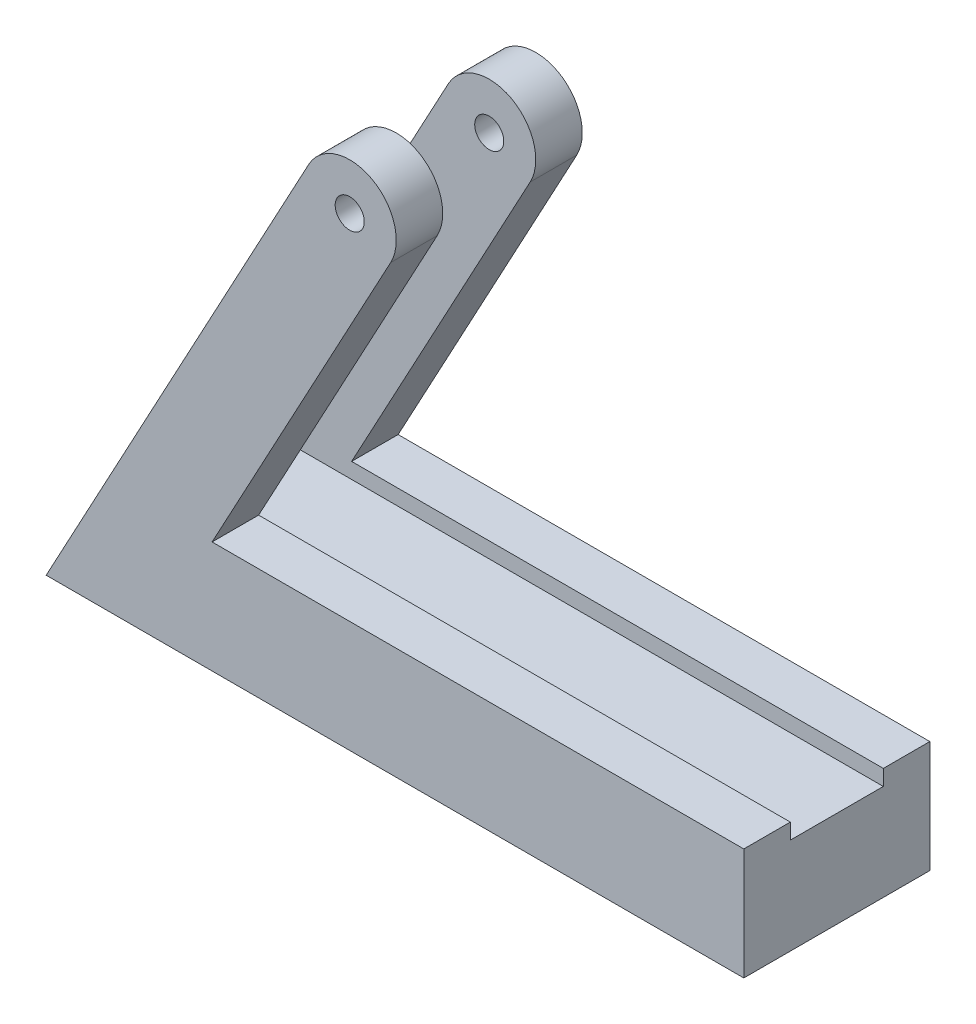
ISO-10303-21;
HEADER;
FILE_DESCRIPTION(('STEP AP214'),'2;1');
FILE_NAME('part.step','',(''),(''),'','','');
FILE_SCHEMA(('AUTOMOTIVE_DESIGN { 1 0 10303 214 1 1 1 1 }'));
ENDSEC;
DATA;
#1=APPLICATION_CONTEXT('core data for automotive mechanical design processes');
#2=APPLICATION_PROTOCOL_DEFINITION('international standard','automotive_design',2000,#1);
#3=PRODUCT_CONTEXT('',#1,'mechanical');
#4=PRODUCT('Part','Part','',(#3));
#5=PRODUCT_RELATED_PRODUCT_CATEGORY('part','',(#4));
#6=PRODUCT_DEFINITION_FORMATION('','',#4);
#7=PRODUCT_DEFINITION_CONTEXT('part definition',#1,'design');
#8=PRODUCT_DEFINITION('design','',#6,#7);
#9=PRODUCT_DEFINITION_SHAPE('','',#8);
#10=(LENGTH_UNIT() NAMED_UNIT(*) SI_UNIT(.MILLI.,.METRE.));
#11=(NAMED_UNIT(*) PLANE_ANGLE_UNIT() SI_UNIT($,.RADIAN.));
#12=(NAMED_UNIT(*) SI_UNIT($,.STERADIAN.) SOLID_ANGLE_UNIT());
#13=UNCERTAINTY_MEASURE_WITH_UNIT(LENGTH_MEASURE(1.E-05),#10,'distance_accuracy_value','');
#14=(GEOMETRIC_REPRESENTATION_CONTEXT(3) GLOBAL_UNCERTAINTY_ASSIGNED_CONTEXT((#13)) GLOBAL_UNIT_ASSIGNED_CONTEXT((#10,
#11,#12)) REPRESENTATION_CONTEXT('',''));
#15=CARTESIAN_POINT('',(0.,0.,0.));
#16=DIRECTION('',(0.,0.,1.));
#17=DIRECTION('',(1.,0.,0.));
#18=AXIS2_PLACEMENT_3D('',#15,#16,#17);
#19=CARTESIAN_POINT('',(13.0532365621115,20.,-7.99999999999997));
#20=DIRECTION('',(0.,0.,1.));
#21=DIRECTION('',(1.,0.,0.));
#22=AXIS2_PLACEMENT_3D('',#19,#20,#21);
#23=CYLINDRICAL_SURFACE('',#22,2.);
#24=CARTESIAN_POINT('',(13.0532365621115,20.,-2.));
#25=DIRECTION('',(0.,0.,1.));
#26=DIRECTION('',(1.,0.,0.));
#27=AXIS2_PLACEMENT_3D('',#24,#25,#26);
#28=CIRCLE('',#27,2.);
#29=CARTESIAN_POINT('',(11.2927328665036,20.949013560362,-2.));
#30=VERTEX_POINT('',#29);
#31=CARTESIAN_POINT('',(14.8137402577193,19.0509864396379,-2.));
#32=VERTEX_POINT('',#31);
#33=EDGE_CURVE('E280',#30,#32,#28,.F.);
#34=ORIENTED_EDGE('',*,*,#33,.F.);
#35=DIRECTION('',(0.,0.,1.));
#36=VECTOR('',#35,1.);
#37=CARTESIAN_POINT('',(11.2927328665036,20.949013560362,-7.99999999999997));
#38=LINE('',#37,#36);
#39=CARTESIAN_POINT('',(11.2927328665036,20.949013560362,0.));
#40=VERTEX_POINT('',#39);
#41=EDGE_CURVE('E117',#30,#40,#38,.T.);
#42=ORIENTED_EDGE('',*,*,#41,.T.);
#43=CARTESIAN_POINT('',(13.0532365621115,20.,0.));
#44=DIRECTION('',(0.,0.,1.));
#45=DIRECTION('',(-1.,0.,0.));
#46=AXIS2_PLACEMENT_3D('',#43,#44,#45);
#47=CIRCLE('',#46,2.);
#48=CARTESIAN_POINT('',(14.8137402577193,19.0509864396379,0.));
#49=VERTEX_POINT('',#48);
#50=EDGE_CURVE('E151',#49,#40,#47,.T.);
#51=ORIENTED_EDGE('',*,*,#50,.F.);
#52=DIRECTION('',(0.,0.,1.));
#53=VECTOR('',#52,1.);
#54=CARTESIAN_POINT('',(14.8137402577193,19.0509864396379,-7.99999999999997));
#55=LINE('',#54,#53);
#56=EDGE_CURVE('E118',#32,#49,#55,.T.);
#57=ORIENTED_EDGE('',*,*,#56,.F.);
#58=EDGE_LOOP('',(#34,#42,#51,#57));
#59=FACE_BOUND('',#58,.T.);
#60=ADVANCED_FACE('F35',(#59),#23,.T.);
#61=CARTESIAN_POINT('',(14.8137402577193,19.0509864396379,-7.99999999999997));
#62=DIRECTION('',(0.880251847803933,-0.474506780181023,0.));
#63=DIRECTION('',(0.474506780181023,0.880251847803933,0.));
#64=AXIS2_PLACEMENT_3D('',#61,#62,#63);
#65=PLANE('',#64);
#66=DIRECTION('',(-0.474506780181023,-0.880251847803933,0.));
#67=VECTOR('',#66,1.);
#68=CARTESIAN_POINT('',(14.8137402577193,19.0509864396379,-2.));
#69=LINE('',#68,#67);
#70=CARTESIAN_POINT('',(7.1350697497973,4.80637669834547,-2.));
#71=VERTEX_POINT('',#70);
#72=EDGE_CURVE('E277',#32,#71,#69,.T.);
#73=ORIENTED_EDGE('',*,*,#72,.F.);
#74=ORIENTED_EDGE('',*,*,#56,.T.);
#75=DIRECTION('',(0.474506780181023,0.880251847803933,0.));
#76=VECTOR('',#75,1.);
#77=CARTESIAN_POINT('',(14.8137402577193,19.0509864396379,0.));
#78=LINE('',#77,#76);
#79=CARTESIAN_POINT('',(7.1350697497973,4.80637669834547,0.));
#80=VERTEX_POINT('',#79);
#81=EDGE_CURVE('E148',#80,#49,#78,.T.);
#82=ORIENTED_EDGE('',*,*,#81,.F.);
#83=DIRECTION('',(0.,0.,1.));
#84=VECTOR('',#83,1.);
#85=CARTESIAN_POINT('',(7.1350697497973,4.80637669834547,-7.99999999999997));
#86=LINE('',#85,#84);
#87=EDGE_CURVE('E162',#71,#80,#86,.T.);
#88=ORIENTED_EDGE('',*,*,#87,.F.);
#89=EDGE_LOOP('',(#73,#74,#82,#88));
#90=FACE_BOUND('',#89,.T.);
#91=ADVANCED_FACE('F187',(#90),#65,.T.);
#92=CARTESIAN_POINT('',(7.1350697497973,4.80637669834547,-7.99999999999997));
#93=DIRECTION('',(0.,1.,0.));
#94=DIRECTION('',(-1.,0.,0.));
#95=AXIS2_PLACEMENT_3D('',#92,#93,#94);
#96=PLANE('',#95);
#97=DIRECTION('',(1.,0.,0.));
#98=VECTOR('',#97,1.);
#99=CARTESIAN_POINT('',(7.1350697497973,4.80637669834547,-2.));
#100=LINE('',#99,#98);
#101=CARTESIAN_POINT('',(30.,4.80637669834547,-2.));
#102=VERTEX_POINT('',#101);
#103=EDGE_CURVE('E274',#71,#102,#100,.T.);
#104=ORIENTED_EDGE('',*,*,#103,.F.);
#105=ORIENTED_EDGE('',*,*,#87,.T.);
#106=DIRECTION('',(-1.,0.,0.));
#107=VECTOR('',#106,1.);
#108=CARTESIAN_POINT('',(7.1350697497973,4.80637669834547,0.));
#109=LINE('',#108,#107);
#110=CARTESIAN_POINT('',(30.,4.80637669834547,0.));
#111=VERTEX_POINT('',#110);
#112=EDGE_CURVE('E145',#111,#80,#109,.T.);
#113=ORIENTED_EDGE('',*,*,#112,.F.);
#114=DIRECTION('',(0.,0.,1.));
#115=VECTOR('',#114,1.);
#116=CARTESIAN_POINT('',(30.,4.80637669834547,-7.99999999999997));
#117=LINE('',#116,#115);
#118=EDGE_CURVE('E166',#102,#111,#117,.T.);
#119=ORIENTED_EDGE('',*,*,#118,.F.);
#120=EDGE_LOOP('',(#104,#105,#113,#119));
#121=FACE_BOUND('',#120,.T.);
#122=ADVANCED_FACE('F175',(#121),#96,.T.);
#123=CARTESIAN_POINT('',(30.,0.,-7.99999999999997));
#124=DIRECTION('',(0.,-1.,0.));
#125=DIRECTION('',(1.,0.,0.));
#126=AXIS2_PLACEMENT_3D('',#123,#124,#125);
#127=PLANE('',#126);
#128=DIRECTION('',(1.,0.,0.));
#129=VECTOR('',#128,1.);
#130=CARTESIAN_POINT('',(30.,0.,0.));
#131=LINE('',#130,#129);
#132=CARTESIAN_POINT('',(0.,0.,0.));
#133=VERTEX_POINT('',#132);
#134=CARTESIAN_POINT('',(30.,0.,0.));
#135=VERTEX_POINT('',#134);
#136=EDGE_CURVE('E138',#133,#135,#131,.T.);
#137=ORIENTED_EDGE('',*,*,#136,.F.);
#138=DIRECTION('',(0.,0.,1.));
#139=VECTOR('',#138,1.);
#140=CARTESIAN_POINT('',(0.,0.,-7.99999999999997));
#141=LINE('',#140,#139);
#142=CARTESIAN_POINT('',(0.,0.,-7.99999999999997));
#143=VERTEX_POINT('',#142);
#144=EDGE_CURVE('E44',#143,#133,#141,.T.);
#145=ORIENTED_EDGE('',*,*,#144,.F.);
#146=DIRECTION('',(1.,0.,0.));
#147=VECTOR('',#146,1.);
#148=CARTESIAN_POINT('',(30.,0.,-7.99999999999997));
#149=LINE('',#148,#147);
#150=CARTESIAN_POINT('',(30.,0.,-7.99999999999997));
#151=VERTEX_POINT('',#150);
#152=EDGE_CURVE('E157',#143,#151,#149,.T.);
#153=ORIENTED_EDGE('',*,*,#152,.T.);
#154=DIRECTION('',(0.,0.,1.));
#155=VECTOR('',#154,1.);
#156=CARTESIAN_POINT('',(30.,0.,-7.99999999999997));
#157=LINE('',#156,#155);
#158=EDGE_CURVE('E91',#151,#135,#157,.T.);
#159=ORIENTED_EDGE('',*,*,#158,.T.);
#160=EDGE_LOOP('',(#137,#145,#153,#159));
#161=FACE_BOUND('',#160,.T.);
#162=ADVANCED_FACE('F37',(#161),#127,.T.);
#163=CARTESIAN_POINT('',(0.,0.,-7.99999999999997));
#164=DIRECTION('',(-0.880251847803933,0.474506780181023,0.));
#165=DIRECTION('',(-0.474506780181024,-0.880251847803933,0.));
#166=AXIS2_PLACEMENT_3D('',#163,#164,#165);
#167=PLANE('',#166);
#168=DIRECTION('',(0.474506780181024,0.880251847803933,0.));
#169=VECTOR('',#168,1.);
#170=CARTESIAN_POINT('',(0.,0.,-2.));
#171=LINE('',#170,#169);
#172=CARTESIAN_POINT('',(2.22830102184853,4.13369455162951,-2.));
#173=VERTEX_POINT('',#172);
#174=EDGE_CURVE('E142',#173,#30,#171,.T.);
#175=ORIENTED_EDGE('',*,*,#174,.F.);
#176=DIRECTION('',(0.,0.,1.));
#177=VECTOR('',#176,1.);
#178=CARTESIAN_POINT('',(2.22830102184853,4.13369455162951,-7.99999999999997));
#179=LINE('',#178,#177);
#180=CARTESIAN_POINT('',(2.22830102184853,4.13369455162951,-5.99999999999997));
#181=VERTEX_POINT('',#180);
#182=EDGE_CURVE('E261',#181,#173,#179,.T.);
#183=ORIENTED_EDGE('',*,*,#182,.F.);
#184=DIRECTION('',(-0.474506780181024,-0.880251847803933,0.));
#185=VECTOR('',#184,1.);
#186=CARTESIAN_POINT('',(0.,0.,-5.99999999999997));
#187=LINE('',#186,#185);
#188=CARTESIAN_POINT('',(11.2927328665036,20.949013560362,-5.99999999999997));
#189=VERTEX_POINT('',#188);
#190=EDGE_CURVE('E271',#189,#181,#187,.T.);
#191=ORIENTED_EDGE('',*,*,#190,.F.);
#192=CARTESIAN_POINT('',(11.2927328665036,20.949013560362,-7.99999999999997));
#193=VERTEX_POINT('',#192);
#194=EDGE_CURVE('E159',#193,#189,#38,.T.);
#195=ORIENTED_EDGE('',*,*,#194,.F.);
#196=DIRECTION('',(-0.474506780181023,-0.880251847803933,0.));
#197=VECTOR('',#196,1.);
#198=CARTESIAN_POINT('',(0.,0.,-7.99999999999997));
#199=LINE('',#198,#197);
#200=EDGE_CURVE('E126',#193,#143,#199,.T.);
#201=ORIENTED_EDGE('',*,*,#200,.T.);
#202=ORIENTED_EDGE('',*,*,#144,.T.);
#203=DIRECTION('',(-0.474506780181023,-0.880251847803933,0.));
#204=VECTOR('',#203,1.);
#205=CARTESIAN_POINT('',(0.,0.,0.));
#206=LINE('',#205,#204);
#207=EDGE_CURVE('E154',#40,#133,#206,.T.);
#208=ORIENTED_EDGE('',*,*,#207,.F.);
#209=ORIENTED_EDGE('',*,*,#41,.F.);
#210=EDGE_LOOP('',(#175,#183,#191,#195,#201,#202,#208,#209));
#211=FACE_BOUND('',#210,.T.);
#212=ADVANCED_FACE('F181',(#211),#167,.T.);
#213=CARTESIAN_POINT('',(13.0532365621115,20.,-5.99999999999997));
#214=DIRECTION('',(0.,0.,-1.));
#215=DIRECTION('',(-1.,0.,0.));
#216=AXIS2_PLACEMENT_3D('',#213,#214,#215);
#217=CIRCLE('',#216,2.);
#218=CARTESIAN_POINT('',(14.8137402577193,19.0509864396379,-5.99999999999997));
#219=VERTEX_POINT('',#218);
#220=EDGE_CURVE('E113',#219,#189,#217,.F.);
#221=ORIENTED_EDGE('',*,*,#220,.F.);
#222=CARTESIAN_POINT('',(14.8137402577193,19.0509864396379,-7.99999999999997));
#223=VERTEX_POINT('',#222);
#224=EDGE_CURVE('E105',#223,#219,#55,.T.);
#225=ORIENTED_EDGE('',*,*,#224,.F.);
#226=CARTESIAN_POINT('',(13.0532365621115,20.,-7.99999999999997));
#227=DIRECTION('',(0.,0.,1.));
#228=DIRECTION('',(-1.,0.,0.));
#229=AXIS2_PLACEMENT_3D('',#226,#227,#228);
#230=CIRCLE('',#229,2.);
#231=EDGE_CURVE('E109',#223,#193,#230,.T.);
#232=ORIENTED_EDGE('',*,*,#231,.T.);
#233=ORIENTED_EDGE('',*,*,#194,.T.);
#234=EDGE_LOOP('',(#221,#225,#232,#233));
#235=FACE_BOUND('',#234,.T.);
#236=ADVANCED_FACE('F107',(#235),#23,.T.);
#237=DIRECTION('',(0.474506780181023,0.880251847803933,0.));
#238=VECTOR('',#237,1.);
#239=CARTESIAN_POINT('',(14.8137402577193,19.0509864396379,-5.99999999999997));
#240=LINE('',#239,#238);
#241=CARTESIAN_POINT('',(7.1350697497973,4.80637669834547,-5.99999999999997));
#242=VERTEX_POINT('',#241);
#243=EDGE_CURVE('E267',#242,#219,#240,.T.);
#244=ORIENTED_EDGE('',*,*,#243,.F.);
#245=CARTESIAN_POINT('',(7.1350697497973,4.80637669834547,-7.99999999999997));
#246=VERTEX_POINT('',#245);
#247=EDGE_CURVE('E130',#246,#242,#86,.T.);
#248=ORIENTED_EDGE('',*,*,#247,.F.);
#249=DIRECTION('',(0.474506780181023,0.880251847803933,0.));
#250=VECTOR('',#249,1.);
#251=CARTESIAN_POINT('',(14.8137402577193,19.0509864396379,-7.99999999999997));
#252=LINE('',#251,#250);
#253=EDGE_CURVE('E124',#246,#223,#252,.T.);
#254=ORIENTED_EDGE('',*,*,#253,.T.);
#255=ORIENTED_EDGE('',*,*,#224,.T.);
#256=EDGE_LOOP('',(#244,#248,#254,#255));
#257=FACE_BOUND('',#256,.T.);
#258=ADVANCED_FACE('F128',(#257),#65,.T.);
#259=DIRECTION('',(-1.,0.,0.));
#260=VECTOR('',#259,1.);
#261=CARTESIAN_POINT('',(7.1350697497973,4.80637669834547,-5.99999999999997));
#262=LINE('',#261,#260);
#263=CARTESIAN_POINT('',(30.,4.80637669834547,-5.99999999999997));
#264=VERTEX_POINT('',#263);
#265=EDGE_CURVE('E264',#264,#242,#262,.T.);
#266=ORIENTED_EDGE('',*,*,#265,.F.);
#267=CARTESIAN_POINT('',(30.,4.80637669834547,-7.99999999999997));
#268=VERTEX_POINT('',#267);
#269=EDGE_CURVE('E163',#268,#264,#117,.T.);
#270=ORIENTED_EDGE('',*,*,#269,.F.);
#271=DIRECTION('',(-1.,0.,0.));
#272=VECTOR('',#271,1.);
#273=CARTESIAN_POINT('',(7.1350697497973,4.80637669834547,-7.99999999999997));
#274=LINE('',#273,#272);
#275=EDGE_CURVE('E131',#268,#246,#274,.T.);
#276=ORIENTED_EDGE('',*,*,#275,.T.);
#277=ORIENTED_EDGE('',*,*,#247,.T.);
#278=EDGE_LOOP('',(#266,#270,#276,#277));
#279=FACE_BOUND('',#278,.T.);
#280=ADVANCED_FACE('F189',(#279),#96,.T.);
#281=CARTESIAN_POINT('',(30.,4.80637669834547,-7.99999999999997));
#282=DIRECTION('',(1.,0.,0.));
#283=DIRECTION('',(0.,0.,-1.));
#284=AXIS2_PLACEMENT_3D('',#281,#282,#283);
#285=PLANE('',#284);
#286=DIRECTION('',(0.,-1.,0.));
#287=VECTOR('',#286,1.);
#288=CARTESIAN_POINT('',(30.,4.80637669834547,-2.));
#289=LINE('',#288,#287);
#290=CARTESIAN_POINT('',(30.,4.13369455162951,-2.));
#291=VERTEX_POINT('',#290);
#292=EDGE_CURVE('E11',#102,#291,#289,.T.);
#293=ORIENTED_EDGE('',*,*,#292,.F.);
#294=ORIENTED_EDGE('',*,*,#118,.T.);
#295=DIRECTION('',(0.,1.,0.));
#296=VECTOR('',#295,1.);
#297=CARTESIAN_POINT('',(30.,4.80637669834547,0.));
#298=LINE('',#297,#296);
#299=EDGE_CURVE('E141',#135,#111,#298,.T.);
#300=ORIENTED_EDGE('',*,*,#299,.F.);
#301=ORIENTED_EDGE('',*,*,#158,.F.);
#302=DIRECTION('',(0.,1.,0.));
#303=VECTOR('',#302,1.);
#304=CARTESIAN_POINT('',(30.,4.80637669834547,-7.99999999999997));
#305=LINE('',#304,#303);
#306=EDGE_CURVE('E133',#151,#268,#305,.T.);
#307=ORIENTED_EDGE('',*,*,#306,.T.);
#308=ORIENTED_EDGE('',*,*,#269,.T.);
#309=DIRECTION('',(0.,1.,0.));
#310=VECTOR('',#309,1.);
#311=CARTESIAN_POINT('',(30.,4.13369455162951,-5.99999999999997));
#312=LINE('',#311,#310);
#313=CARTESIAN_POINT('',(30.,4.13369455162951,-5.99999999999997));
#314=VERTEX_POINT('',#313);
#315=EDGE_CURVE('E255',#314,#264,#312,.T.);
#316=ORIENTED_EDGE('',*,*,#315,.F.);
#317=DIRECTION('',(0.,0.,-1.));
#318=VECTOR('',#317,1.);
#319=CARTESIAN_POINT('',(30.,4.13369455162951,-2.));
#320=LINE('',#319,#318);
#321=EDGE_CURVE('E249',#291,#314,#320,.T.);
#322=ORIENTED_EDGE('',*,*,#321,.F.);
#323=EDGE_LOOP('',(#293,#294,#300,#301,#307,#308,#316,#322));
#324=FACE_BOUND('',#323,.T.);
#325=ADVANCED_FACE('F170',(#324),#285,.T.);
#326=CARTESIAN_POINT('',(13.0532365621115,20.,-7.99999999999997));
#327=DIRECTION('',(0.,0.,-1.));
#328=DIRECTION('',(-1.,0.,0.));
#329=AXIS2_PLACEMENT_3D('',#326,#327,#328);
#330=PLANE('',#329);
#331=CARTESIAN_POINT('',(13.0532365621115,20.,-7.99999999999997));
#332=DIRECTION('',(0.,0.,-1.));
#333=DIRECTION('',(-1.,0.,0.));
#334=AXIS2_PLACEMENT_3D('',#331,#332,#333);
#335=CIRCLE('',#334,0.625000000000002);
#336=CARTESIAN_POINT('',(12.4282365621115,20.,-7.99999999999997));
#337=VERTEX_POINT('',#336);
#338=EDGE_CURVE('E246',#337,#337,#335,.T.);
#339=ORIENTED_EDGE('',*,*,#338,.F.);
#340=EDGE_LOOP('',(#339));
#341=FACE_BOUND('',#340,.T.);
#342=ORIENTED_EDGE('',*,*,#152,.F.);
#343=ORIENTED_EDGE('',*,*,#200,.F.);
#344=ORIENTED_EDGE('',*,*,#231,.F.);
#345=ORIENTED_EDGE('',*,*,#253,.F.);
#346=ORIENTED_EDGE('',*,*,#275,.F.);
#347=ORIENTED_EDGE('',*,*,#306,.F.);
#348=EDGE_LOOP('',(#342,#343,#344,#345,#346,#347));
#349=FACE_BOUND('',#348,.T.);
#350=ADVANCED_FACE('F122',(#341,#349),#330,.T.);
#351=CARTESIAN_POINT('',(13.0532365621115,20.,0.));
#352=DIRECTION('',(0.,0.,-1.));
#353=DIRECTION('',(-1.,0.,0.));
#354=AXIS2_PLACEMENT_3D('',#351,#352,#353);
#355=PLANE('',#354);
#356=CARTESIAN_POINT('',(13.0532365621115,20.,0.));
#357=DIRECTION('',(0.,0.,1.));
#358=DIRECTION('',(1.,0.,0.));
#359=AXIS2_PLACEMENT_3D('',#356,#357,#358);
#360=CIRCLE('',#359,0.625000000000002);
#361=CARTESIAN_POINT('',(13.6782365621115,20.,0.));
#362=VERTEX_POINT('',#361);
#363=EDGE_CURVE('E242',#362,#362,#360,.T.);
#364=ORIENTED_EDGE('',*,*,#363,.F.);
#365=EDGE_LOOP('',(#364));
#366=FACE_BOUND('',#365,.T.);
#367=ORIENTED_EDGE('',*,*,#136,.T.);
#368=ORIENTED_EDGE('',*,*,#299,.T.);
#369=ORIENTED_EDGE('',*,*,#112,.T.);
#370=ORIENTED_EDGE('',*,*,#81,.T.);
#371=ORIENTED_EDGE('',*,*,#50,.T.);
#372=ORIENTED_EDGE('',*,*,#207,.T.);
#373=EDGE_LOOP('',(#367,#368,#369,#370,#371,#372));
#374=FACE_BOUND('',#373,.T.);
#375=ADVANCED_FACE('F179',(#366,#374),#355,.F.);
#376=CARTESIAN_POINT('',(-58.,4.13369455162951,-2.));
#377=DIRECTION('',(0.,0.,1.));
#378=DIRECTION('',(1.,0.,0.));
#379=AXIS2_PLACEMENT_3D('',#376,#377,#378);
#380=PLANE('',#379);
#381=CARTESIAN_POINT('',(13.0532365621115,20.,-2.));
#382=DIRECTION('',(0.,0.,1.));
#383=DIRECTION('',(1.,0.,0.));
#384=AXIS2_PLACEMENT_3D('',#381,#382,#383);
#385=CIRCLE('',#384,0.625000000000002);
#386=CARTESIAN_POINT('',(13.6782365621115,20.,-2.));
#387=VERTEX_POINT('',#386);
#388=EDGE_CURVE('E245',#387,#387,#385,.T.);
#389=ORIENTED_EDGE('',*,*,#388,.T.);
#390=EDGE_LOOP('',(#389));
#391=FACE_BOUND('',#390,.T.);
#392=ORIENTED_EDGE('',*,*,#174,.T.);
#393=ORIENTED_EDGE('',*,*,#33,.T.);
#394=ORIENTED_EDGE('',*,*,#72,.T.);
#395=ORIENTED_EDGE('',*,*,#103,.T.);
#396=ORIENTED_EDGE('',*,*,#292,.T.);
#397=DIRECTION('',(1.,0.,0.));
#398=VECTOR('',#397,1.);
#399=CARTESIAN_POINT('',(-58.,4.13369455162951,-2.));
#400=LINE('',#399,#398);
#401=EDGE_CURVE('E51',#173,#291,#400,.T.);
#402=ORIENTED_EDGE('',*,*,#401,.F.);
#403=EDGE_LOOP('',(#392,#393,#394,#395,#396,#402));
#404=FACE_BOUND('',#403,.T.);
#405=ADVANCED_FACE('F216',(#391,#404),#380,.F.);
#406=CARTESIAN_POINT('',(-58.,4.13369455162951,-5.99999999999997));
#407=DIRECTION('',(0.,0.,-1.));
#408=DIRECTION('',(-1.,0.,0.));
#409=AXIS2_PLACEMENT_3D('',#406,#407,#408);
#410=PLANE('',#409);
#411=CARTESIAN_POINT('',(13.0532365621115,20.,-5.99999999999996));
#412=DIRECTION('',(0.,0.,-1.));
#413=DIRECTION('',(-1.,0.,0.));
#414=AXIS2_PLACEMENT_3D('',#411,#412,#413);
#415=CIRCLE('',#414,0.625000000000002);
#416=CARTESIAN_POINT('',(12.4282365621115,20.,-5.99999999999996));
#417=VERTEX_POINT('',#416);
#418=EDGE_CURVE('E39',#417,#417,#415,.T.);
#419=ORIENTED_EDGE('',*,*,#418,.T.);
#420=EDGE_LOOP('',(#419));
#421=FACE_BOUND('',#420,.T.);
#422=ORIENTED_EDGE('',*,*,#190,.T.);
#423=DIRECTION('',(1.,0.,0.));
#424=VECTOR('',#423,1.);
#425=CARTESIAN_POINT('',(-58.,4.13369455162951,-5.99999999999997));
#426=LINE('',#425,#424);
#427=EDGE_CURVE('E258',#181,#314,#426,.T.);
#428=ORIENTED_EDGE('',*,*,#427,.T.);
#429=ORIENTED_EDGE('',*,*,#315,.T.);
#430=ORIENTED_EDGE('',*,*,#265,.T.);
#431=ORIENTED_EDGE('',*,*,#243,.T.);
#432=ORIENTED_EDGE('',*,*,#220,.T.);
#433=EDGE_LOOP('',(#422,#428,#429,#430,#431,#432));
#434=FACE_BOUND('',#433,.T.);
#435=ADVANCED_FACE('F223',(#421,#434),#410,.F.);
#436=CARTESIAN_POINT('',(-58.,4.13369455162951,-2.));
#437=DIRECTION('',(0.,-1.,0.));
#438=DIRECTION('',(0.,0.,-1.));
#439=AXIS2_PLACEMENT_3D('',#436,#437,#438);
#440=PLANE('',#439);
#441=ORIENTED_EDGE('',*,*,#182,.T.);
#442=ORIENTED_EDGE('',*,*,#401,.T.);
#443=ORIENTED_EDGE('',*,*,#321,.T.);
#444=ORIENTED_EDGE('',*,*,#427,.F.);
#445=EDGE_LOOP('',(#441,#442,#443,#444));
#446=FACE_BOUND('',#445,.T.);
#447=ADVANCED_FACE('F225',(#446),#440,.F.);
#448=CARTESIAN_POINT('',(13.0532365621115,20.,-88.));
#449=DIRECTION('',(0.,0.,1.));
#450=DIRECTION('',(1.,0.,0.));
#451=AXIS2_PLACEMENT_3D('',#448,#449,#450);
#452=CYLINDRICAL_SURFACE('',#451,0.625000000000002);
#453=ORIENTED_EDGE('',*,*,#338,.T.);
#454=EDGE_LOOP('',(#453));
#455=FACE_BOUND('',#454,.T.);
#456=ORIENTED_EDGE('',*,*,#418,.F.);
#457=EDGE_LOOP('',(#456));
#458=FACE_BOUND('',#457,.T.);
#459=ADVANCED_FACE('F228',(#455,#458),#452,.F.);
#460=ORIENTED_EDGE('',*,*,#363,.T.);
#461=EDGE_LOOP('',(#460));
#462=FACE_BOUND('',#461,.T.);
#463=ORIENTED_EDGE('',*,*,#388,.F.);
#464=EDGE_LOOP('',(#463));
#465=FACE_BOUND('',#464,.T.);
#466=ADVANCED_FACE('F232',(#462,#465),#452,.F.);
#467=CLOSED_SHELL('',(#60,#91,#122,#162,#212,#236,#258,#280,#325,#350,#375,#405,#435,#447,#459,#466));
#468=MANIFOLD_SOLID_BREP('B2',#467);
#469=ADVANCED_BREP_SHAPE_REPRESENTATION('',(#18,#468),#14);
#470=SHAPE_DEFINITION_REPRESENTATION(#9,#469);
ENDSEC;
END-ISO-10303-21;
